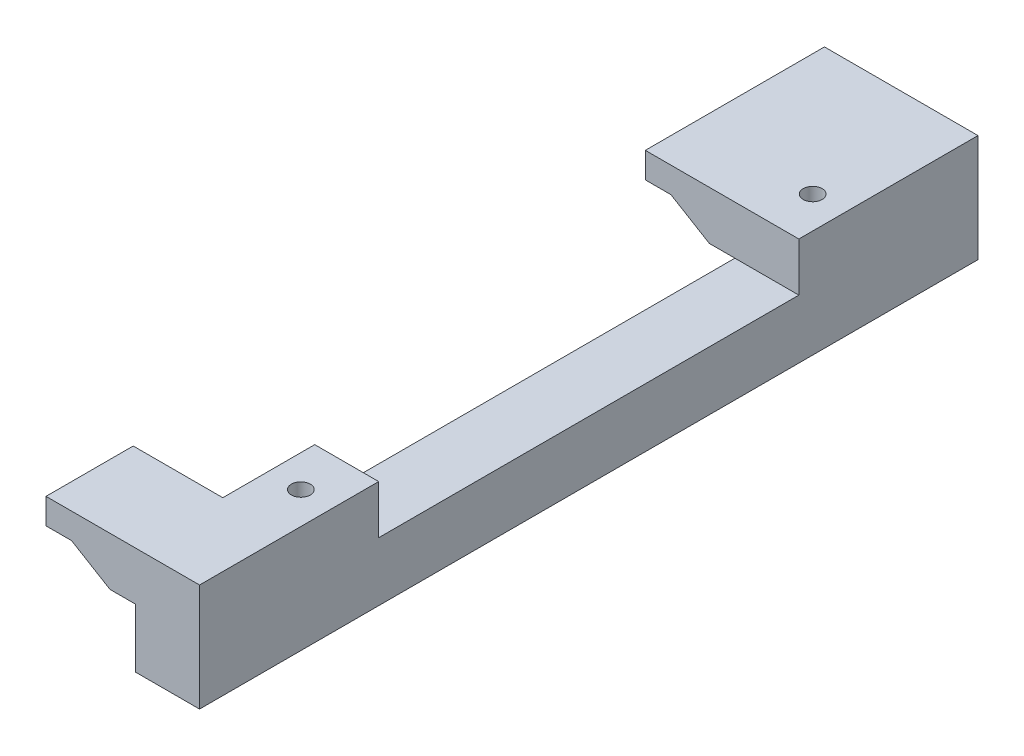
ISO-10303-21;
HEADER;
FILE_DESCRIPTION(('STEP AP214'),'2;1');
FILE_NAME('part.step','',(''),(''),'','','');
FILE_SCHEMA(('AUTOMOTIVE_DESIGN { 1 0 10303 214 1 1 1 1 }'));
ENDSEC;
DATA;
#1=APPLICATION_CONTEXT('core data for automotive mechanical design processes');
#2=APPLICATION_PROTOCOL_DEFINITION('international standard','automotive_design',2000,#1);
#3=PRODUCT_CONTEXT('',#1,'mechanical');
#4=PRODUCT('Part','Part','',(#3));
#5=PRODUCT_RELATED_PRODUCT_CATEGORY('part','',(#4));
#6=PRODUCT_DEFINITION_FORMATION('','',#4);
#7=PRODUCT_DEFINITION_CONTEXT('part definition',#1,'design');
#8=PRODUCT_DEFINITION('design','',#6,#7);
#9=PRODUCT_DEFINITION_SHAPE('','',#8);
#10=(LENGTH_UNIT() NAMED_UNIT(*) SI_UNIT(.MILLI.,.METRE.));
#11=(NAMED_UNIT(*) PLANE_ANGLE_UNIT() SI_UNIT($,.RADIAN.));
#12=(NAMED_UNIT(*) SI_UNIT($,.STERADIAN.) SOLID_ANGLE_UNIT());
#13=UNCERTAINTY_MEASURE_WITH_UNIT(LENGTH_MEASURE(1.E-05),#10,'distance_accuracy_value','');
#14=(GEOMETRIC_REPRESENTATION_CONTEXT(3) GLOBAL_UNCERTAINTY_ASSIGNED_CONTEXT((#13)) GLOBAL_UNIT_ASSIGNED_CONTEXT((#10,
#11,#12)) REPRESENTATION_CONTEXT('',''));
#15=CARTESIAN_POINT('',(0.,0.,0.));
#16=DIRECTION('',(0.,0.,1.));
#17=DIRECTION('',(1.,0.,0.));
#18=AXIS2_PLACEMENT_3D('',#15,#16,#17);
#19=CARTESIAN_POINT('',(-19.13,18.75,129.035));
#20=DIRECTION('',(0.,-1.,0.));
#21=DIRECTION('',(0.,0.,-1.));
#22=AXIS2_PLACEMENT_3D('',#19,#20,#21);
#23=CYLINDRICAL_SURFACE('',#22,3.50000000000001);
#24=CARTESIAN_POINT('',(-19.13,15.75,129.035));
#25=DIRECTION('',(0.,1.,0.));
#26=DIRECTION('',(0.,0.,-1.));
#27=AXIS2_PLACEMENT_3D('',#24,#25,#26);
#28=CIRCLE('',#27,3.50000000000001);
#29=CARTESIAN_POINT('',(-21.13,15.75,126.162718676731));
#30=VERTEX_POINT('',#29);
#31=CARTESIAN_POINT('',(-21.13,15.75,131.907281323269));
#32=VERTEX_POINT('',#31);
#33=EDGE_CURVE('E78',#30,#32,#28,.T.);
#34=ORIENTED_EDGE('',*,*,#33,.T.);
#35=DIRECTION('',(0.,-1.,0.));
#36=VECTOR('',#35,1.);
#37=CARTESIAN_POINT('',(-21.13,18.75,131.907281323269));
#38=LINE('',#37,#36);
#39=CARTESIAN_POINT('',(-21.13,18.75,131.907281323269));
#40=VERTEX_POINT('',#39);
#41=EDGE_CURVE('E12',#40,#32,#38,.T.);
#42=ORIENTED_EDGE('',*,*,#41,.F.);
#43=CARTESIAN_POINT('',(-19.13,18.75,129.035));
#44=DIRECTION('',(0.,1.,0.));
#45=DIRECTION('',(0.,0.,-1.));
#46=AXIS2_PLACEMENT_3D('',#43,#44,#45);
#47=CIRCLE('',#46,3.50000000000001);
#48=CARTESIAN_POINT('',(-21.13,18.75,126.162718676731));
#49=VERTEX_POINT('',#48);
#50=EDGE_CURVE('E77',#49,#40,#47,.T.);
#51=ORIENTED_EDGE('',*,*,#50,.F.);
#52=DIRECTION('',(0.,-1.,0.));
#53=VECTOR('',#52,1.);
#54=CARTESIAN_POINT('',(-21.13,18.75,126.162718676731));
#55=LINE('',#54,#53);
#56=EDGE_CURVE('E55',#49,#30,#55,.T.);
#57=ORIENTED_EDGE('',*,*,#56,.T.);
#58=EDGE_LOOP('',(#34,#42,#51,#57));
#59=FACE_BOUND('',#58,.T.);
#60=ADVANCED_FACE('F47',(#59),#23,.T.);
#61=CARTESIAN_POINT('',(-21.13,18.75,131.907281323269));
#62=DIRECTION('',(-1.,0.,0.));
#63=DIRECTION('',(0.,0.,1.));
#64=AXIS2_PLACEMENT_3D('',#61,#62,#63);
#65=PLANE('',#64);
#66=DIRECTION('',(0.,0.,-1.));
#67=VECTOR('',#66,1.);
#68=CARTESIAN_POINT('',(-21.13,15.75,131.907281323269));
#69=LINE('',#68,#67);
#70=EDGE_CURVE('E70',#32,#30,#69,.T.);
#71=ORIENTED_EDGE('',*,*,#70,.T.);
#72=ORIENTED_EDGE('',*,*,#56,.F.);
#73=DIRECTION('',(0.,0.,-1.));
#74=VECTOR('',#73,1.);
#75=CARTESIAN_POINT('',(-21.13,18.75,131.907281323269));
#76=LINE('',#75,#74);
#77=EDGE_CURVE('E62',#40,#49,#76,.T.);
#78=ORIENTED_EDGE('',*,*,#77,.F.);
#79=ORIENTED_EDGE('',*,*,#41,.T.);
#80=EDGE_LOOP('',(#71,#72,#78,#79));
#81=FACE_BOUND('',#80,.T.);
#82=ADVANCED_FACE('F73',(#81),#65,.F.);
#83=CARTESIAN_POINT('',(-19.13,18.75,129.035));
#84=DIRECTION('',(0.,-1.,0.));
#85=DIRECTION('',(0.,0.,-1.));
#86=AXIS2_PLACEMENT_3D('',#83,#84,#85);
#87=PLANE('',#86);
#88=ORIENTED_EDGE('',*,*,#50,.T.);
#89=ORIENTED_EDGE('',*,*,#77,.T.);
#90=EDGE_LOOP('',(#88,#89));
#91=FACE_BOUND('',#90,.T.);
#92=ADVANCED_FACE('F85',(#91),#87,.F.);
#93=CARTESIAN_POINT('',(-19.13,15.75,129.035));
#94=DIRECTION('',(0.,-1.,0.));
#95=DIRECTION('',(0.,0.,-1.));
#96=AXIS2_PLACEMENT_3D('',#93,#94,#95);
#97=PLANE('',#96);
#98=ORIENTED_EDGE('',*,*,#33,.F.);
#99=ORIENTED_EDGE('',*,*,#70,.F.);
#100=EDGE_LOOP('',(#98,#99));
#101=FACE_BOUND('',#100,.T.);
#102=ADVANCED_FACE('F81',(#101),#97,.T.);
#103=CLOSED_SHELL('',(#60,#82,#92,#102));
#104=MANIFOLD_SOLID_BREP('B2',#103);
#105=CARTESIAN_POINT('',(-38.63,31.,104.035));
#106=DIRECTION('',(0.,0.,1.));
#107=DIRECTION('',(1.,0.,0.));
#108=AXIS2_PLACEMENT_3D('',#105,#106,#107);
#109=PLANE('',#108);
#110=DIRECTION('',(0.,-1.,0.));
#111=VECTOR('',#110,1.);
#112=CARTESIAN_POINT('',(-21.13,31.,104.035));
#113=LINE('',#112,#111);
#114=CARTESIAN_POINT('',(-21.13,31.,104.035));
#115=VERTEX_POINT('',#114);
#116=CARTESIAN_POINT('',(-21.13,21.5,104.035));
#117=VERTEX_POINT('',#116);
#118=EDGE_CURVE('E246',#115,#117,#113,.T.);
#119=ORIENTED_EDGE('',*,*,#118,.F.);
#120=DIRECTION('',(1.,0.,0.));
#121=VECTOR('',#120,1.);
#122=CARTESIAN_POINT('',(-38.63,31.,104.035));
#123=LINE('',#122,#121);
#124=CARTESIAN_POINT('',(-8.63000000000001,31.,104.035));
#125=VERTEX_POINT('',#124);
#126=EDGE_CURVE('E280',#115,#125,#123,.T.);
#127=ORIENTED_EDGE('',*,*,#126,.T.);
#128=DIRECTION('',(0.,-1.,0.));
#129=VECTOR('',#128,1.);
#130=CARTESIAN_POINT('',(-8.63000000000001,31.,104.035));
#131=LINE('',#130,#129);
#132=CARTESIAN_POINT('',(-8.63000000000001,21.5,104.035));
#133=VERTEX_POINT('',#132);
#134=EDGE_CURVE('E270',#125,#133,#131,.T.);
#135=ORIENTED_EDGE('',*,*,#134,.T.);
#136=DIRECTION('',(1.,0.,0.));
#137=VECTOR('',#136,1.);
#138=CARTESIAN_POINT('',(-38.63,21.5,104.035));
#139=LINE('',#138,#137);
#140=EDGE_CURVE('E262',#117,#133,#139,.T.);
#141=ORIENTED_EDGE('',*,*,#140,.F.);
#142=EDGE_LOOP('',(#119,#127,#135,#141));
#143=FACE_BOUND('',#142,.T.);
#144=ADVANCED_FACE('F119',(#143),#109,.F.);
#145=CARTESIAN_POINT('',(-38.63,10.,-13.055));
#146=DIRECTION('',(-1.,0.,0.));
#147=DIRECTION('',(0.,0.,1.));
#148=AXIS2_PLACEMENT_3D('',#145,#146,#147);
#149=PLANE('',#148);
#150=DIRECTION('',(0.,1.,0.));
#151=VECTOR('',#150,1.);
#152=CARTESIAN_POINT('',(-38.63,31.,121.995));
#153=LINE('',#152,#151);
#154=CARTESIAN_POINT('',(-38.63,26.,121.995));
#155=VERTEX_POINT('',#154);
#156=CARTESIAN_POINT('',(-38.63,31.,121.995));
#157=VERTEX_POINT('',#156);
#158=EDGE_CURVE('E257',#155,#157,#153,.T.);
#159=ORIENTED_EDGE('',*,*,#158,.F.);
#160=DIRECTION('',(0.,0.,1.));
#161=VECTOR('',#160,1.);
#162=CARTESIAN_POINT('',(-38.63,26.,-36.7668114027588));
#163=LINE('',#162,#161);
#164=CARTESIAN_POINT('',(-38.63,26.,139.035));
#165=VERTEX_POINT('',#164);
#166=EDGE_CURVE('E326',#155,#165,#163,.T.);
#167=ORIENTED_EDGE('',*,*,#166,.T.);
#168=DIRECTION('',(0.,-1.,0.));
#169=VECTOR('',#168,1.);
#170=CARTESIAN_POINT('',(-38.63,10.,139.035));
#171=LINE('',#170,#169);
#172=CARTESIAN_POINT('',(-38.63,31.,139.035));
#173=VERTEX_POINT('',#172);
#174=EDGE_CURVE('E345',#173,#165,#171,.T.);
#175=ORIENTED_EDGE('',*,*,#174,.F.);
#176=DIRECTION('',(0.,0.,1.));
#177=VECTOR('',#176,1.);
#178=CARTESIAN_POINT('',(-38.63,31.,-13.055));
#179=LINE('',#178,#177);
#180=EDGE_CURVE('E377',#157,#173,#179,.T.);
#181=ORIENTED_EDGE('',*,*,#180,.F.);
#182=EDGE_LOOP('',(#159,#167,#175,#181));
#183=FACE_BOUND('',#182,.T.);
#184=ADVANCED_FACE('F461',(#183),#149,.T.);
#185=CARTESIAN_POINT('',(-38.63,31.,-13.055));
#186=DIRECTION('',(0.,1.,0.));
#187=DIRECTION('',(0.,0.,1.));
#188=AXIS2_PLACEMENT_3D('',#185,#186,#187);
#189=PLANE('',#188);
#190=DIRECTION('',(-1.,0.,0.));
#191=VECTOR('',#190,1.);
#192=CARTESIAN_POINT('',(-21.13,31.,121.995));
#193=LINE('',#192,#191);
#194=CARTESIAN_POINT('',(-21.13,31.,121.995));
#195=VERTEX_POINT('',#194);
#196=EDGE_CURVE('E425',#195,#157,#193,.T.);
#197=ORIENTED_EDGE('',*,*,#196,.T.);
#198=ORIENTED_EDGE('',*,*,#180,.T.);
#199=DIRECTION('',(-1.,0.,0.));
#200=VECTOR('',#199,1.);
#201=CARTESIAN_POINT('',(-38.63,31.,139.035));
#202=LINE('',#201,#200);
#203=CARTESIAN_POINT('',(-8.63000000000001,31.,139.035));
#204=VERTEX_POINT('',#203);
#205=EDGE_CURVE('E356',#204,#173,#202,.T.);
#206=ORIENTED_EDGE('',*,*,#205,.F.);
#207=DIRECTION('',(0.,0.,1.));
#208=VECTOR('',#207,1.);
#209=CARTESIAN_POINT('',(-8.63000000000001,31.,-13.055));
#210=LINE('',#209,#208);
#211=EDGE_CURVE('E381',#125,#204,#210,.T.);
#212=ORIENTED_EDGE('',*,*,#211,.F.);
#213=ORIENTED_EDGE('',*,*,#126,.F.);
#214=DIRECTION('',(0.,0.,-1.));
#215=VECTOR('',#214,1.);
#216=CARTESIAN_POINT('',(-21.13,31.,104.035));
#217=LINE('',#216,#215);
#218=EDGE_CURVE('E134',#195,#115,#217,.T.);
#219=ORIENTED_EDGE('',*,*,#218,.F.);
#220=EDGE_LOOP('',(#197,#198,#206,#212,#213,#219));
#221=FACE_BOUND('',#220,.T.);
#222=CARTESIAN_POINT('',(-14.88,31.,112.99));
#223=DIRECTION('',(0.,1.,0.));
#224=DIRECTION('',(0.,0.,1.));
#225=AXIS2_PLACEMENT_3D('',#222,#223,#224);
#226=CIRCLE('',#225,1.85);
#227=CARTESIAN_POINT('',(-14.88,31.,114.84));
#228=VERTEX_POINT('',#227);
#229=EDGE_CURVE('E287',#228,#228,#226,.T.);
#230=ORIENTED_EDGE('',*,*,#229,.F.);
#231=EDGE_LOOP('',(#230));
#232=FACE_BOUND('',#231,.T.);
#233=ADVANCED_FACE('F423',(#221,#232),#189,.T.);
#234=CARTESIAN_POINT('',(-21.13,21.5,-36.7668114027588));
#235=DIRECTION('',(0.,1.,0.));
#236=DIRECTION('',(-1.,0.,0.));
#237=AXIS2_PLACEMENT_3D('',#234,#235,#236);
#238=PLANE('',#237);
#239=DIRECTION('',(0.,0.,1.));
#240=VECTOR('',#239,1.);
#241=CARTESIAN_POINT('',(-26.13,21.5,-36.7668114027588));
#242=LINE('',#241,#240);
#243=CARTESIAN_POINT('',(-26.13,21.5,121.995));
#244=VERTEX_POINT('',#243);
#245=CARTESIAN_POINT('',(-26.13,21.5,139.035));
#246=VERTEX_POINT('',#245);
#247=EDGE_CURVE('E336',#244,#246,#242,.T.);
#248=ORIENTED_EDGE('',*,*,#247,.F.);
#249=DIRECTION('',(-1.,0.,0.));
#250=VECTOR('',#249,1.);
#251=CARTESIAN_POINT('',(-21.13,21.5,121.995));
#252=LINE('',#251,#250);
#253=CARTESIAN_POINT('',(-21.13,21.5,121.995));
#254=VERTEX_POINT('',#253);
#255=EDGE_CURVE('E418',#254,#244,#252,.T.);
#256=ORIENTED_EDGE('',*,*,#255,.F.);
#257=DIRECTION('',(0.,0.,1.));
#258=VECTOR('',#257,1.);
#259=CARTESIAN_POINT('',(-21.13,21.5,-36.7668114027588));
#260=LINE('',#259,#258);
#261=CARTESIAN_POINT('',(-21.13,21.5,139.035));
#262=VERTEX_POINT('',#261);
#263=EDGE_CURVE('E341',#254,#262,#260,.T.);
#264=ORIENTED_EDGE('',*,*,#263,.T.);
#265=DIRECTION('',(-1.,0.,0.));
#266=VECTOR('',#265,1.);
#267=CARTESIAN_POINT('',(-21.13,21.5,139.035));
#268=LINE('',#267,#266);
#269=EDGE_CURVE('E318',#262,#246,#268,.T.);
#270=ORIENTED_EDGE('',*,*,#269,.T.);
#271=EDGE_LOOP('',(#248,#256,#264,#270));
#272=FACE_BOUND('',#271,.T.);
#273=ADVANCED_FACE('F416',(#272),#238,.F.);
#274=CARTESIAN_POINT('',(-26.13,21.5,-36.7668114027588));
#275=DIRECTION('',(0.514495755427527,0.857492925712544,0.));
#276=DIRECTION('',(-0.857492925712544,0.514495755427527,0.));
#277=AXIS2_PLACEMENT_3D('',#274,#275,#276);
#278=PLANE('',#277);
#279=DIRECTION('',(0.,0.,1.));
#280=VECTOR('',#279,1.);
#281=CARTESIAN_POINT('',(-33.63,26.,-36.7668114027588));
#282=LINE('',#281,#280);
#283=CARTESIAN_POINT('',(-33.63,26.,121.995));
#284=VERTEX_POINT('',#283);
#285=CARTESIAN_POINT('',(-33.63,26.,139.035));
#286=VERTEX_POINT('',#285);
#287=EDGE_CURVE('E331',#284,#286,#282,.T.);
#288=ORIENTED_EDGE('',*,*,#287,.F.);
#289=DIRECTION('',(0.857492925712544,-0.514495755427527,0.));
#290=VECTOR('',#289,1.);
#291=CARTESIAN_POINT('',(-26.13,21.5,121.995));
#292=LINE('',#291,#290);
#293=EDGE_CURVE('E432',#284,#244,#292,.T.);
#294=ORIENTED_EDGE('',*,*,#293,.T.);
#295=ORIENTED_EDGE('',*,*,#247,.T.);
#296=DIRECTION('',(-0.857492925712544,0.514495755427527,0.));
#297=VECTOR('',#296,1.);
#298=CARTESIAN_POINT('',(-26.13,21.5,139.035));
#299=LINE('',#298,#297);
#300=EDGE_CURVE('E315',#246,#286,#299,.T.);
#301=ORIENTED_EDGE('',*,*,#300,.T.);
#302=EDGE_LOOP('',(#288,#294,#295,#301));
#303=FACE_BOUND('',#302,.T.);
#304=ADVANCED_FACE('F449',(#303),#278,.F.);
#305=CARTESIAN_POINT('',(-33.63,26.,-36.7668114027588));
#306=DIRECTION('',(0.,1.,0.));
#307=DIRECTION('',(0.,0.,1.));
#308=AXIS2_PLACEMENT_3D('',#305,#306,#307);
#309=PLANE('',#308);
#310=ORIENTED_EDGE('',*,*,#166,.F.);
#311=DIRECTION('',(1.,0.,0.));
#312=VECTOR('',#311,1.);
#313=CARTESIAN_POINT('',(-33.63,26.,121.995));
#314=LINE('',#313,#312);
#315=EDGE_CURVE('E45',#155,#284,#314,.T.);
#316=ORIENTED_EDGE('',*,*,#315,.T.);
#317=ORIENTED_EDGE('',*,*,#287,.T.);
#318=DIRECTION('',(-1.,0.,0.));
#319=VECTOR('',#318,1.);
#320=CARTESIAN_POINT('',(-33.63,26.,139.035));
#321=LINE('',#320,#319);
#322=EDGE_CURVE('E311',#286,#165,#321,.T.);
#323=ORIENTED_EDGE('',*,*,#322,.T.);
#324=EDGE_LOOP('',(#310,#316,#317,#323));
#325=FACE_BOUND('',#324,.T.);
#326=ADVANCED_FACE('F456',(#325),#309,.F.);
#327=CARTESIAN_POINT('',(-21.13,10.,-36.7668114027588));
#328=DIRECTION('',(1.,0.,0.));
#329=DIRECTION('',(0.,1.,0.));
#330=AXIS2_PLACEMENT_3D('',#327,#328,#329);
#331=PLANE('',#330);
#332=DIRECTION('',(0.,0.,1.));
#333=VECTOR('',#332,1.);
#334=CARTESIAN_POINT('',(-21.13,10.,-36.7668114027588));
#335=LINE('',#334,#333);
#336=CARTESIAN_POINT('',(-21.13,10.,-13.055));
#337=VERTEX_POINT('',#336);
#338=CARTESIAN_POINT('',(-21.13,10.,139.035));
#339=VERTEX_POINT('',#338);
#340=EDGE_CURVE('E314',#337,#339,#335,.T.);
#341=ORIENTED_EDGE('',*,*,#340,.T.);
#342=DIRECTION('',(0.,1.,0.));
#343=VECTOR('',#342,1.);
#344=CARTESIAN_POINT('',(-21.13,10.,139.035));
#345=LINE('',#344,#343);
#346=EDGE_CURVE('E308',#339,#262,#345,.T.);
#347=ORIENTED_EDGE('',*,*,#346,.T.);
#348=ORIENTED_EDGE('',*,*,#263,.F.);
#349=DIRECTION('',(0.,1.,0.));
#350=VECTOR('',#349,1.);
#351=CARTESIAN_POINT('',(-21.13,31.,121.995));
#352=LINE('',#351,#350);
#353=EDGE_CURVE('E256',#254,#195,#352,.T.);
#354=ORIENTED_EDGE('',*,*,#353,.T.);
#355=ORIENTED_EDGE('',*,*,#218,.T.);
#356=ORIENTED_EDGE('',*,*,#118,.T.);
#357=DIRECTION('',(0.,0.,-1.));
#358=VECTOR('',#357,1.);
#359=CARTESIAN_POINT('',(-21.13,21.5,-36.7668114027588));
#360=LINE('',#359,#358);
#361=CARTESIAN_POINT('',(-21.13,21.5,21.945));
#362=VERTEX_POINT('',#361);
#363=EDGE_CURVE('E251',#117,#362,#360,.T.);
#364=ORIENTED_EDGE('',*,*,#363,.T.);
#365=CARTESIAN_POINT('',(-21.13,21.5,-13.055));
#366=VERTEX_POINT('',#365);
#367=EDGE_CURVE('E337',#366,#362,#260,.T.);
#368=ORIENTED_EDGE('',*,*,#367,.F.);
#369=DIRECTION('',(0.,1.,0.));
#370=VECTOR('',#369,1.);
#371=CARTESIAN_POINT('',(-21.13,10.,-13.055));
#372=LINE('',#371,#370);
#373=EDGE_CURVE('E338',#337,#366,#372,.T.);
#374=ORIENTED_EDGE('',*,*,#373,.F.);
#375=EDGE_LOOP('',(#341,#347,#348,#354,#355,#356,#364,#368,#374));
#376=FACE_BOUND('',#375,.T.);
#377=DIRECTION('',(0.,0.,1.));
#378=VECTOR('',#377,1.);
#379=CARTESIAN_POINT('',(-21.13,15.5,7.817281323269));
#380=LINE('',#379,#378);
#381=CARTESIAN_POINT('',(-21.13,15.5,2.07271867673098));
#382=VERTEX_POINT('',#381);
#383=CARTESIAN_POINT('',(-21.13,15.5,7.817281323269));
#384=VERTEX_POINT('',#383);
#385=EDGE_CURVE('E297',#382,#384,#380,.T.);
#386=ORIENTED_EDGE('',*,*,#385,.F.);
#387=DIRECTION('',(0.,1.,0.));
#388=VECTOR('',#387,1.);
#389=CARTESIAN_POINT('',(-21.13,15.5,2.07271867673098));
#390=LINE('',#389,#388);
#391=CARTESIAN_POINT('',(-21.13,19.,2.07271867673098));
#392=VERTEX_POINT('',#391);
#393=EDGE_CURVE('E301',#382,#392,#390,.T.);
#394=ORIENTED_EDGE('',*,*,#393,.T.);
#395=DIRECTION('',(0.,0.,1.));
#396=VECTOR('',#395,1.);
#397=CARTESIAN_POINT('',(-21.13,19.,7.817281323269));
#398=LINE('',#397,#396);
#399=CARTESIAN_POINT('',(-21.13,19.,7.81728132326899));
#400=VERTEX_POINT('',#399);
#401=EDGE_CURVE('E298',#392,#400,#398,.T.);
#402=ORIENTED_EDGE('',*,*,#401,.T.);
#403=DIRECTION('',(0.,1.,0.));
#404=VECTOR('',#403,1.);
#405=CARTESIAN_POINT('',(-21.13,15.5,7.817281323269));
#406=LINE('',#405,#404);
#407=EDGE_CURVE('E305',#384,#400,#406,.T.);
#408=ORIENTED_EDGE('',*,*,#407,.F.);
#409=EDGE_LOOP('',(#386,#394,#402,#408));
#410=FACE_BOUND('',#409,.T.);
#411=ADVANCED_FACE('F248',(#376,#410),#331,.F.);
#412=DIRECTION('',(0.,1.,0.));
#413=VECTOR('',#412,1.);
#414=CARTESIAN_POINT('',(-38.63,31.,21.945));
#415=LINE('',#414,#413);
#416=CARTESIAN_POINT('',(-38.63,26.,21.945));
#417=VERTEX_POINT('',#416);
#418=CARTESIAN_POINT('',(-38.63,31.,21.945));
#419=VERTEX_POINT('',#418);
#420=EDGE_CURVE('E142',#417,#419,#415,.T.);
#421=ORIENTED_EDGE('',*,*,#420,.T.);
#422=CARTESIAN_POINT('',(-38.63,31.,-13.055));
#423=VERTEX_POINT('',#422);
#424=EDGE_CURVE('E374',#423,#419,#179,.T.);
#425=ORIENTED_EDGE('',*,*,#424,.F.);
#426=DIRECTION('',(0.,-1.,0.));
#427=VECTOR('',#426,1.);
#428=CARTESIAN_POINT('',(-38.63,10.,-13.055));
#429=LINE('',#428,#427);
#430=CARTESIAN_POINT('',(-38.63,26.,-13.055));
#431=VERTEX_POINT('',#430);
#432=EDGE_CURVE('E352',#423,#431,#429,.T.);
#433=ORIENTED_EDGE('',*,*,#432,.T.);
#434=EDGE_CURVE('E342',#431,#417,#163,.T.);
#435=ORIENTED_EDGE('',*,*,#434,.T.);
#436=EDGE_LOOP('',(#421,#425,#433,#435));
#437=FACE_BOUND('',#436,.T.);
#438=ADVANCED_FACE('F121',(#437),#149,.T.);
#439=DIRECTION('',(1.,0.,0.));
#440=VECTOR('',#439,1.);
#441=CARTESIAN_POINT('',(-38.63,31.,21.945));
#442=LINE('',#441,#440);
#443=CARTESIAN_POINT('',(-8.63000000000001,31.,21.945));
#444=VERTEX_POINT('',#443);
#445=EDGE_CURVE('E396',#419,#444,#442,.T.);
#446=ORIENTED_EDGE('',*,*,#445,.T.);
#447=CARTESIAN_POINT('',(-8.63000000000001,31.,-13.055));
#448=VERTEX_POINT('',#447);
#449=EDGE_CURVE('E378',#448,#444,#210,.T.);
#450=ORIENTED_EDGE('',*,*,#449,.F.);
#451=DIRECTION('',(-1.,0.,0.));
#452=VECTOR('',#451,1.);
#453=CARTESIAN_POINT('',(-38.63,31.,-13.055));
#454=LINE('',#453,#452);
#455=EDGE_CURVE('E361',#448,#423,#454,.T.);
#456=ORIENTED_EDGE('',*,*,#455,.T.);
#457=ORIENTED_EDGE('',*,*,#424,.T.);
#458=EDGE_LOOP('',(#446,#450,#456,#457));
#459=FACE_BOUND('',#458,.T.);
#460=CARTESIAN_POINT('',(-14.88,31.,12.99));
#461=DIRECTION('',(0.,1.,0.));
#462=DIRECTION('',(0.,0.,1.));
#463=AXIS2_PLACEMENT_3D('',#460,#461,#462);
#464=CIRCLE('',#463,1.85);
#465=CARTESIAN_POINT('',(-14.88,31.,14.84));
#466=VERTEX_POINT('',#465);
#467=EDGE_CURVE('E266',#466,#466,#464,.T.);
#468=ORIENTED_EDGE('',*,*,#467,.F.);
#469=EDGE_LOOP('',(#468));
#470=FACE_BOUND('',#469,.T.);
#471=ADVANCED_FACE('F394',(#459,#470),#189,.T.);
#472=CARTESIAN_POINT('',(-8.63000000000001,10.,-13.055));
#473=DIRECTION('',(1.,0.,0.));
#474=DIRECTION('',(0.,0.,-1.));
#475=AXIS2_PLACEMENT_3D('',#472,#473,#474);
#476=PLANE('',#475);
#477=ORIENTED_EDGE('',*,*,#134,.F.);
#478=ORIENTED_EDGE('',*,*,#211,.T.);
#479=DIRECTION('',(0.,1.,0.));
#480=VECTOR('',#479,1.);
#481=CARTESIAN_POINT('',(-8.63000000000001,10.,139.035));
#482=LINE('',#481,#480);
#483=CARTESIAN_POINT('',(-8.63000000000001,10.,139.035));
#484=VERTEX_POINT('',#483);
#485=EDGE_CURVE('E369',#484,#204,#482,.T.);
#486=ORIENTED_EDGE('',*,*,#485,.F.);
#487=DIRECTION('',(0.,0.,1.));
#488=VECTOR('',#487,1.);
#489=CARTESIAN_POINT('',(-8.63000000000001,10.,-13.055));
#490=LINE('',#489,#488);
#491=CARTESIAN_POINT('',(-8.63000000000001,10.,-13.055));
#492=VERTEX_POINT('',#491);
#493=EDGE_CURVE('E364',#492,#484,#490,.T.);
#494=ORIENTED_EDGE('',*,*,#493,.F.);
#495=DIRECTION('',(0.,1.,0.));
#496=VECTOR('',#495,1.);
#497=CARTESIAN_POINT('',(-8.63000000000001,10.,-13.055));
#498=LINE('',#497,#496);
#499=EDGE_CURVE('E358',#492,#448,#498,.T.);
#500=ORIENTED_EDGE('',*,*,#499,.T.);
#501=ORIENTED_EDGE('',*,*,#449,.T.);
#502=DIRECTION('',(0.,1.,0.));
#503=VECTOR('',#502,1.);
#504=CARTESIAN_POINT('',(-8.63000000000001,31.,21.945));
#505=LINE('',#504,#503);
#506=CARTESIAN_POINT('',(-8.63000000000001,21.5,21.945));
#507=VERTEX_POINT('',#506);
#508=EDGE_CURVE('E275',#507,#444,#505,.T.);
#509=ORIENTED_EDGE('',*,*,#508,.F.);
#510=DIRECTION('',(0.,0.,-1.));
#511=VECTOR('',#510,1.);
#512=CARTESIAN_POINT('',(-8.63000000000001,21.5,104.035));
#513=LINE('',#512,#511);
#514=EDGE_CURVE('E437',#133,#507,#513,.T.);
#515=ORIENTED_EDGE('',*,*,#514,.F.);
#516=EDGE_LOOP('',(#477,#478,#486,#494,#500,#501,#509,#515));
#517=FACE_BOUND('',#516,.T.);
#518=ADVANCED_FACE('F400',(#517),#476,.T.);
#519=CARTESIAN_POINT('',(-38.63,10.,-13.055));
#520=DIRECTION('',(0.,-1.,0.));
#521=DIRECTION('',(0.,0.,-1.));
#522=AXIS2_PLACEMENT_3D('',#519,#520,#521);
#523=PLANE('',#522);
#524=CARTESIAN_POINT('',(-14.88,10.,12.99));
#525=DIRECTION('',(0.,-1.,0.));
#526=DIRECTION('',(0.,0.,-1.));
#527=AXIS2_PLACEMENT_3D('',#524,#525,#526);
#528=CIRCLE('',#527,1.85);
#529=CARTESIAN_POINT('',(-14.88,10.,11.14));
#530=VERTEX_POINT('',#529);
#531=EDGE_CURVE('E284',#530,#530,#528,.T.);
#532=ORIENTED_EDGE('',*,*,#531,.F.);
#533=EDGE_LOOP('',(#532));
#534=FACE_BOUND('',#533,.T.);
#535=CARTESIAN_POINT('',(-14.88,10.,112.99));
#536=DIRECTION('',(0.,-1.,0.));
#537=DIRECTION('',(0.,0.,-1.));
#538=AXIS2_PLACEMENT_3D('',#535,#536,#537);
#539=CIRCLE('',#538,1.85);
#540=CARTESIAN_POINT('',(-14.88,10.,111.14));
#541=VERTEX_POINT('',#540);
#542=EDGE_CURVE('E290',#541,#541,#539,.T.);
#543=ORIENTED_EDGE('',*,*,#542,.F.);
#544=EDGE_LOOP('',(#543));
#545=FACE_BOUND('',#544,.T.);
#546=ORIENTED_EDGE('',*,*,#340,.F.);
#547=DIRECTION('',(1.,0.,0.));
#548=VECTOR('',#547,1.);
#549=CARTESIAN_POINT('',(-38.63,10.,-13.055));
#550=LINE('',#549,#548);
#551=EDGE_CURVE('E355',#337,#492,#550,.T.);
#552=ORIENTED_EDGE('',*,*,#551,.T.);
#553=ORIENTED_EDGE('',*,*,#493,.T.);
#554=DIRECTION('',(1.,0.,0.));
#555=VECTOR('',#554,1.);
#556=CARTESIAN_POINT('',(-38.63,10.,139.035));
#557=LINE('',#556,#555);
#558=EDGE_CURVE('E367',#339,#484,#557,.T.);
#559=ORIENTED_EDGE('',*,*,#558,.F.);
#560=EDGE_LOOP('',(#546,#552,#553,#559));
#561=FACE_BOUND('',#560,.T.);
#562=ADVANCED_FACE('F405',(#534,#545,#561),#523,.T.);
#563=CARTESIAN_POINT('',(0.,0.,-13.055));
#564=DIRECTION('',(0.,0.,-1.));
#565=DIRECTION('',(-1.,0.,0.));
#566=AXIS2_PLACEMENT_3D('',#563,#564,#565);
#567=PLANE('',#566);
#568=ORIENTED_EDGE('',*,*,#373,.T.);
#569=DIRECTION('',(-1.,0.,0.));
#570=VECTOR('',#569,1.);
#571=CARTESIAN_POINT('',(-21.13,21.5,-13.055));
#572=LINE('',#571,#570);
#573=CARTESIAN_POINT('',(-26.13,21.5,-13.055));
#574=VERTEX_POINT('',#573);
#575=EDGE_CURVE('E333',#366,#574,#572,.T.);
#576=ORIENTED_EDGE('',*,*,#575,.T.);
#577=DIRECTION('',(-0.857492925712544,0.514495755427527,0.));
#578=VECTOR('',#577,1.);
#579=CARTESIAN_POINT('',(-26.13,21.5,-13.055));
#580=LINE('',#579,#578);
#581=CARTESIAN_POINT('',(-33.63,26.,-13.055));
#582=VERTEX_POINT('',#581);
#583=EDGE_CURVE('E328',#574,#582,#580,.T.);
#584=ORIENTED_EDGE('',*,*,#583,.T.);
#585=DIRECTION('',(-1.,0.,0.));
#586=VECTOR('',#585,1.);
#587=CARTESIAN_POINT('',(-33.63,26.,-13.055));
#588=LINE('',#587,#586);
#589=EDGE_CURVE('E323',#582,#431,#588,.T.);
#590=ORIENTED_EDGE('',*,*,#589,.T.);
#591=ORIENTED_EDGE('',*,*,#432,.F.);
#592=ORIENTED_EDGE('',*,*,#455,.F.);
#593=ORIENTED_EDGE('',*,*,#499,.F.);
#594=ORIENTED_EDGE('',*,*,#551,.F.);
#595=EDGE_LOOP('',(#568,#576,#584,#590,#591,#592,#593,#594));
#596=FACE_BOUND('',#595,.T.);
#597=ADVANCED_FACE('F390',(#596),#567,.T.);
#598=CARTESIAN_POINT('',(0.,0.,139.035));
#599=DIRECTION('',(0.,0.,-1.));
#600=DIRECTION('',(-1.,0.,0.));
#601=AXIS2_PLACEMENT_3D('',#598,#599,#600);
#602=PLANE('',#601);
#603=ORIENTED_EDGE('',*,*,#269,.F.);
#604=ORIENTED_EDGE('',*,*,#346,.F.);
#605=ORIENTED_EDGE('',*,*,#558,.T.);
#606=ORIENTED_EDGE('',*,*,#485,.T.);
#607=ORIENTED_EDGE('',*,*,#205,.T.);
#608=ORIENTED_EDGE('',*,*,#174,.T.);
#609=ORIENTED_EDGE('',*,*,#322,.F.);
#610=ORIENTED_EDGE('',*,*,#300,.F.);
#611=EDGE_LOOP('',(#603,#604,#605,#606,#607,#608,#609,#610));
#612=FACE_BOUND('',#611,.T.);
#613=ADVANCED_FACE('F411',(#612),#602,.F.);
#614=ORIENTED_EDGE('',*,*,#367,.T.);
#615=DIRECTION('',(1.,0.,0.));
#616=VECTOR('',#615,1.);
#617=CARTESIAN_POINT('',(-38.63,21.5,21.945));
#618=LINE('',#617,#616);
#619=CARTESIAN_POINT('',(-26.13,21.5,21.945));
#620=VERTEX_POINT('',#619);
#621=EDGE_CURVE('E273',#620,#362,#618,.T.);
#622=ORIENTED_EDGE('',*,*,#621,.F.);
#623=EDGE_CURVE('E332',#574,#620,#242,.T.);
#624=ORIENTED_EDGE('',*,*,#623,.F.);
#625=ORIENTED_EDGE('',*,*,#575,.F.);
#626=EDGE_LOOP('',(#614,#622,#624,#625));
#627=FACE_BOUND('',#626,.T.);
#628=ADVANCED_FACE('F444',(#627),#238,.F.);
#629=ORIENTED_EDGE('',*,*,#623,.T.);
#630=DIRECTION('',(-0.857492925712544,0.514495755427527,0.));
#631=VECTOR('',#630,1.);
#632=CARTESIAN_POINT('',(-26.13,21.5,21.945));
#633=LINE('',#632,#631);
#634=CARTESIAN_POINT('',(-33.63,26.,21.945));
#635=VERTEX_POINT('',#634);
#636=EDGE_CURVE('E267',#620,#635,#633,.T.);
#637=ORIENTED_EDGE('',*,*,#636,.T.);
#638=EDGE_CURVE('E327',#582,#635,#282,.T.);
#639=ORIENTED_EDGE('',*,*,#638,.F.);
#640=ORIENTED_EDGE('',*,*,#583,.F.);
#641=EDGE_LOOP('',(#629,#637,#639,#640));
#642=FACE_BOUND('',#641,.T.);
#643=ADVANCED_FACE('F446',(#642),#278,.F.);
#644=ORIENTED_EDGE('',*,*,#638,.T.);
#645=DIRECTION('',(-1.,0.,0.));
#646=VECTOR('',#645,1.);
#647=CARTESIAN_POINT('',(-33.63,26.,21.945));
#648=LINE('',#647,#646);
#649=EDGE_CURVE('E127',#635,#417,#648,.T.);
#650=ORIENTED_EDGE('',*,*,#649,.T.);
#651=ORIENTED_EDGE('',*,*,#434,.F.);
#652=ORIENTED_EDGE('',*,*,#589,.F.);
#653=EDGE_LOOP('',(#644,#650,#651,#652));
#654=FACE_BOUND('',#653,.T.);
#655=ADVANCED_FACE('F384',(#654),#309,.F.);
#656=CARTESIAN_POINT('',(-23.13,15.5,4.94499999999999));
#657=DIRECTION('',(0.,1.,0.));
#658=DIRECTION('',(0.,0.,1.));
#659=AXIS2_PLACEMENT_3D('',#656,#657,#658);
#660=CYLINDRICAL_SURFACE('',#659,3.5);
#661=CARTESIAN_POINT('',(-23.13,19.,4.94499999999999));
#662=DIRECTION('',(0.,1.,0.));
#663=DIRECTION('',(0.,0.,1.));
#664=AXIS2_PLACEMENT_3D('',#661,#662,#663);
#665=CIRCLE('',#664,3.5);
#666=EDGE_CURVE('E293',#400,#392,#665,.T.);
#667=ORIENTED_EDGE('',*,*,#666,.T.);
#668=ORIENTED_EDGE('',*,*,#393,.F.);
#669=CARTESIAN_POINT('',(-23.13,15.5,4.94499999999999));
#670=DIRECTION('',(0.,1.,0.));
#671=DIRECTION('',(0.,0.,1.));
#672=AXIS2_PLACEMENT_3D('',#669,#670,#671);
#673=CIRCLE('',#672,3.5);
#674=EDGE_CURVE('E294',#384,#382,#673,.T.);
#675=ORIENTED_EDGE('',*,*,#674,.F.);
#676=ORIENTED_EDGE('',*,*,#407,.T.);
#677=EDGE_LOOP('',(#667,#668,#675,#676));
#678=FACE_BOUND('',#677,.T.);
#679=ADVANCED_FACE('F454',(#678),#660,.F.);
#680=CARTESIAN_POINT('',(-23.13,15.5,4.94499999999999));
#681=DIRECTION('',(0.,1.,0.));
#682=DIRECTION('',(0.,0.,1.));
#683=AXIS2_PLACEMENT_3D('',#680,#681,#682);
#684=PLANE('',#683);
#685=ORIENTED_EDGE('',*,*,#674,.T.);
#686=ORIENTED_EDGE('',*,*,#385,.T.);
#687=EDGE_LOOP('',(#685,#686));
#688=FACE_BOUND('',#687,.T.);
#689=ADVANCED_FACE('F479',(#688),#684,.T.);
#690=CARTESIAN_POINT('',(-23.13,19.,4.94499999999999));
#691=DIRECTION('',(0.,1.,0.));
#692=DIRECTION('',(0.,0.,1.));
#693=AXIS2_PLACEMENT_3D('',#690,#691,#692);
#694=PLANE('',#693);
#695=ORIENTED_EDGE('',*,*,#666,.F.);
#696=ORIENTED_EDGE('',*,*,#401,.F.);
#697=EDGE_LOOP('',(#695,#696));
#698=FACE_BOUND('',#697,.T.);
#699=ADVANCED_FACE('F477',(#698),#694,.F.);
#700=CARTESIAN_POINT('',(-14.88,31.,112.99));
#701=DIRECTION('',(0.,1.,0.));
#702=DIRECTION('',(0.,0.,1.));
#703=AXIS2_PLACEMENT_3D('',#700,#701,#702);
#704=CYLINDRICAL_SURFACE('',#703,1.85);
#705=ORIENTED_EDGE('',*,*,#229,.T.);
#706=EDGE_LOOP('',(#705));
#707=FACE_BOUND('',#706,.T.);
#708=ORIENTED_EDGE('',*,*,#542,.T.);
#709=EDGE_LOOP('',(#708));
#710=FACE_BOUND('',#709,.T.);
#711=ADVANCED_FACE('F473',(#707,#710),#704,.F.);
#712=CARTESIAN_POINT('',(-14.88,31.,12.99));
#713=DIRECTION('',(0.,1.,0.));
#714=DIRECTION('',(0.,0.,1.));
#715=AXIS2_PLACEMENT_3D('',#712,#713,#714);
#716=CYLINDRICAL_SURFACE('',#715,1.85);
#717=ORIENTED_EDGE('',*,*,#467,.T.);
#718=EDGE_LOOP('',(#717));
#719=FACE_BOUND('',#718,.T.);
#720=ORIENTED_EDGE('',*,*,#531,.T.);
#721=EDGE_LOOP('',(#720));
#722=FACE_BOUND('',#721,.T.);
#723=ADVANCED_FACE('F470',(#719,#722),#716,.F.);
#724=CARTESIAN_POINT('',(-38.63,21.5,104.035));
#725=DIRECTION('',(0.,-1.,0.));
#726=DIRECTION('',(0.,0.,-1.));
#727=AXIS2_PLACEMENT_3D('',#724,#725,#726);
#728=PLANE('',#727);
#729=ORIENTED_EDGE('',*,*,#140,.T.);
#730=ORIENTED_EDGE('',*,*,#514,.T.);
#731=EDGE_CURVE('E264',#362,#507,#618,.T.);
#732=ORIENTED_EDGE('',*,*,#731,.F.);
#733=ORIENTED_EDGE('',*,*,#363,.F.);
#734=EDGE_LOOP('',(#729,#730,#732,#733));
#735=FACE_BOUND('',#734,.T.);
#736=ADVANCED_FACE('F260',(#735),#728,.F.);
#737=CARTESIAN_POINT('',(-38.63,31.,21.945));
#738=DIRECTION('',(0.,0.,-1.));
#739=DIRECTION('',(-1.,0.,0.));
#740=AXIS2_PLACEMENT_3D('',#737,#738,#739);
#741=PLANE('',#740);
#742=ORIENTED_EDGE('',*,*,#621,.T.);
#743=ORIENTED_EDGE('',*,*,#731,.T.);
#744=ORIENTED_EDGE('',*,*,#508,.T.);
#745=ORIENTED_EDGE('',*,*,#445,.F.);
#746=ORIENTED_EDGE('',*,*,#420,.F.);
#747=ORIENTED_EDGE('',*,*,#649,.F.);
#748=ORIENTED_EDGE('',*,*,#636,.F.);
#749=EDGE_LOOP('',(#742,#743,#744,#745,#746,#747,#748));
#750=FACE_BOUND('',#749,.T.);
#751=ADVANCED_FACE('F441',(#750),#741,.F.);
#752=CARTESIAN_POINT('',(-21.13,31.,121.995));
#753=DIRECTION('',(0.,0.,1.));
#754=DIRECTION('',(1.,0.,0.));
#755=AXIS2_PLACEMENT_3D('',#752,#753,#754);
#756=PLANE('',#755);
#757=ORIENTED_EDGE('',*,*,#315,.F.);
#758=ORIENTED_EDGE('',*,*,#158,.T.);
#759=ORIENTED_EDGE('',*,*,#196,.F.);
#760=ORIENTED_EDGE('',*,*,#353,.F.);
#761=ORIENTED_EDGE('',*,*,#255,.T.);
#762=ORIENTED_EDGE('',*,*,#293,.F.);
#763=EDGE_LOOP('',(#757,#758,#759,#760,#761,#762));
#764=FACE_BOUND('',#763,.T.);
#765=ADVANCED_FACE('F555',(#764),#756,.F.);
#766=CLOSED_SHELL('',(#144,#184,#233,#273,#304,#326,#411,#438,#471,#518,#562,#597,#613,#628,
#643,#655,#679,#689,#699,#711,#723,#736,#751,#765));
#767=MANIFOLD_SOLID_BREP('B6',#766);
#768=ADVANCED_BREP_SHAPE_REPRESENTATION('',(#18,#104,#767),#14);
#769=SHAPE_DEFINITION_REPRESENTATION(#9,#768);
ENDSEC;
END-ISO-10303-21;
